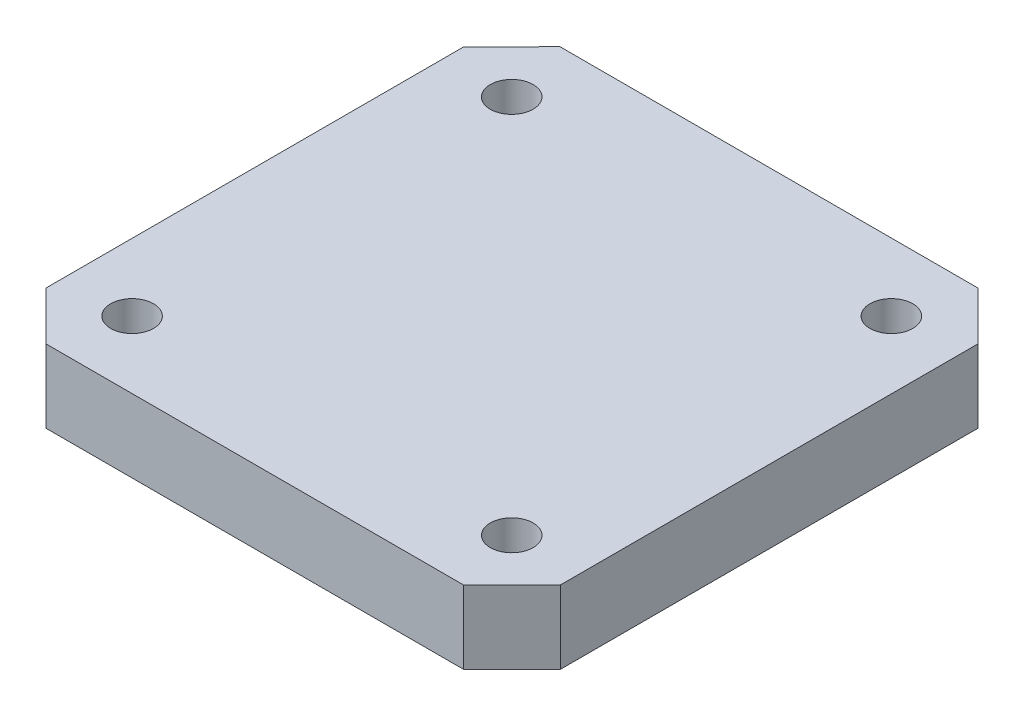
ISO-10303-21;
HEADER;
FILE_DESCRIPTION(('STEP AP214'),'2;1');
FILE_NAME('part.step','',(''),(''),'','','');
FILE_SCHEMA(('AUTOMOTIVE_DESIGN { 1 0 10303 214 1 1 1 1 }'));
ENDSEC;
DATA;
#1=APPLICATION_CONTEXT('core data for automotive mechanical design processes');
#2=APPLICATION_PROTOCOL_DEFINITION('international standard','automotive_design',2000,#1);
#3=PRODUCT_CONTEXT('',#1,'mechanical');
#4=PRODUCT('Part','Part','',(#3));
#5=PRODUCT_RELATED_PRODUCT_CATEGORY('part','',(#4));
#6=PRODUCT_DEFINITION_FORMATION('','',#4);
#7=PRODUCT_DEFINITION_CONTEXT('part definition',#1,'design');
#8=PRODUCT_DEFINITION('design','',#6,#7);
#9=PRODUCT_DEFINITION_SHAPE('','',#8);
#10=(LENGTH_UNIT() NAMED_UNIT(*) SI_UNIT(.MILLI.,.METRE.));
#11=(NAMED_UNIT(*) PLANE_ANGLE_UNIT() SI_UNIT($,.RADIAN.));
#12=(NAMED_UNIT(*) SI_UNIT($,.STERADIAN.) SOLID_ANGLE_UNIT());
#13=UNCERTAINTY_MEASURE_WITH_UNIT(LENGTH_MEASURE(1.E-05),#10,'distance_accuracy_value','');
#14=(GEOMETRIC_REPRESENTATION_CONTEXT(3) GLOBAL_UNCERTAINTY_ASSIGNED_CONTEXT((#13)) GLOBAL_UNIT_ASSIGNED_CONTEXT((#10,
#11,#12)) REPRESENTATION_CONTEXT('',''));
#15=CARTESIAN_POINT('',(0.,0.,0.));
#16=DIRECTION('',(0.,0.,1.));
#17=DIRECTION('',(1.,0.,0.));
#18=AXIS2_PLACEMENT_3D('',#15,#16,#17);
#19=CARTESIAN_POINT('',(0.,5.969,0.));
#20=DIRECTION('',(0.,0.,-1.));
#21=DIRECTION('',(-1.,0.,0.));
#22=AXIS2_PLACEMENT_3D('',#19,#20,#21);
#23=PLANE('',#22);
#24=DIRECTION('',(1.,0.,0.));
#25=VECTOR('',#24,1.);
#26=CARTESIAN_POINT('',(0.,0.,0.));
#27=LINE('',#26,#25);
#28=CARTESIAN_POINT('',(3.951224,0.,0.));
#29=VERTEX_POINT('',#28);
#30=CARTESIAN_POINT('',(38.048776,0.,0.));
#31=VERTEX_POINT('',#30);
#32=EDGE_CURVE('E134',#29,#31,#27,.T.);
#33=ORIENTED_EDGE('',*,*,#32,.T.);
#34=DIRECTION('',(0.,-1.,0.));
#35=VECTOR('',#34,1.);
#36=CARTESIAN_POINT('',(38.048776,5.969,0.));
#37=LINE('',#36,#35);
#38=CARTESIAN_POINT('',(38.048776,5.969,0.));
#39=VERTEX_POINT('',#38);
#40=EDGE_CURVE('E11',#39,#31,#37,.T.);
#41=ORIENTED_EDGE('',*,*,#40,.F.);
#42=DIRECTION('',(1.,0.,0.));
#43=VECTOR('',#42,1.);
#44=CARTESIAN_POINT('',(0.,5.969,0.));
#45=LINE('',#44,#43);
#46=CARTESIAN_POINT('',(3.951224,5.969,0.));
#47=VERTEX_POINT('',#46);
#48=EDGE_CURVE('E153',#47,#39,#45,.T.);
#49=ORIENTED_EDGE('',*,*,#48,.F.);
#50=DIRECTION('',(0.,-1.,0.));
#51=VECTOR('',#50,1.);
#52=CARTESIAN_POINT('',(3.951224,5.969,0.));
#53=LINE('',#52,#51);
#54=EDGE_CURVE('E130',#47,#29,#53,.T.);
#55=ORIENTED_EDGE('',*,*,#54,.T.);
#56=EDGE_LOOP('',(#33,#41,#49,#55));
#57=FACE_BOUND('',#56,.T.);
#58=ADVANCED_FACE('F39',(#57),#23,.F.);
#59=CARTESIAN_POINT('',(19.024388,5.969,19.024388));
#60=DIRECTION('',(-0.707106781186547,0.,-0.707106781186548));
#61=DIRECTION('',(-0.707106781186548,0.,0.707106781186547));
#62=AXIS2_PLACEMENT_3D('',#59,#60,#61);
#63=PLANE('',#62);
#64=DIRECTION('',(0.707106781186548,0.,-0.707106781186547));
#65=VECTOR('',#64,1.);
#66=CARTESIAN_POINT('',(19.024388,0.,19.024388));
#67=LINE('',#66,#65);
#68=CARTESIAN_POINT('',(42.,0.,-3.95122399999999));
#69=VERTEX_POINT('',#68);
#70=EDGE_CURVE('E137',#31,#69,#67,.T.);
#71=ORIENTED_EDGE('',*,*,#70,.T.);
#72=DIRECTION('',(0.,-1.,0.));
#73=VECTOR('',#72,1.);
#74=CARTESIAN_POINT('',(42.,5.969,-3.95122399999999));
#75=LINE('',#74,#73);
#76=CARTESIAN_POINT('',(42.,5.969,-3.95122399999999));
#77=VERTEX_POINT('',#76);
#78=EDGE_CURVE('E47',#77,#69,#75,.T.);
#79=ORIENTED_EDGE('',*,*,#78,.F.);
#80=DIRECTION('',(0.707106781186548,0.,-0.707106781186547));
#81=VECTOR('',#80,1.);
#82=CARTESIAN_POINT('',(19.024388,5.969,19.024388));
#83=LINE('',#82,#81);
#84=EDGE_CURVE('E94',#39,#77,#83,.T.);
#85=ORIENTED_EDGE('',*,*,#84,.F.);
#86=ORIENTED_EDGE('',*,*,#40,.T.);
#87=EDGE_LOOP('',(#71,#79,#85,#86));
#88=FACE_BOUND('',#87,.T.);
#89=ADVANCED_FACE('F230',(#88),#63,.F.);
#90=CARTESIAN_POINT('',(42.,5.969,0.));
#91=DIRECTION('',(-1.,0.,0.));
#92=DIRECTION('',(0.,0.,1.));
#93=AXIS2_PLACEMENT_3D('',#90,#91,#92);
#94=PLANE('',#93);
#95=DIRECTION('',(0.,0.,-1.));
#96=VECTOR('',#95,1.);
#97=CARTESIAN_POINT('',(42.,0.,0.));
#98=LINE('',#97,#96);
#99=CARTESIAN_POINT('',(42.,0.,-38.0541279210894));
#100=VERTEX_POINT('',#99);
#101=EDGE_CURVE('E140',#69,#100,#98,.T.);
#102=ORIENTED_EDGE('',*,*,#101,.T.);
#103=DIRECTION('',(0.,-1.,0.));
#104=VECTOR('',#103,1.);
#105=CARTESIAN_POINT('',(42.,5.969,-38.0541279210894));
#106=LINE('',#105,#104);
#107=CARTESIAN_POINT('',(42.,5.969,-38.0541279210894));
#108=VERTEX_POINT('',#107);
#109=EDGE_CURVE('E159',#108,#100,#106,.T.);
#110=ORIENTED_EDGE('',*,*,#109,.F.);
#111=DIRECTION('',(0.,0.,-1.));
#112=VECTOR('',#111,1.);
#113=CARTESIAN_POINT('',(42.,5.969,0.));
#114=LINE('',#113,#112);
#115=EDGE_CURVE('E166',#77,#108,#114,.T.);
#116=ORIENTED_EDGE('',*,*,#115,.F.);
#117=ORIENTED_EDGE('',*,*,#78,.T.);
#118=EDGE_LOOP('',(#102,#110,#116,#117));
#119=FACE_BOUND('',#118,.T.);
#120=ADVANCED_FACE('F164',(#119),#94,.F.);
#121=CARTESIAN_POINT('',(39.9692013751688,5.969,-40.0793455981002));
#122=DIRECTION('',(0.706133156569534,0.,-0.708079067049116));
#123=DIRECTION('',(-0.708079067049116,0.,-0.706133156569534));
#124=AXIS2_PLACEMENT_3D('',#121,#122,#123);
#125=PLANE('',#124);
#126=DIRECTION('',(0.708079067049116,0.,0.706133156569534));
#127=VECTOR('',#126,1.);
#128=CARTESIAN_POINT('',(39.9692013751688,0.,-40.0793455981002));
#129=LINE('',#128,#127);
#130=CARTESIAN_POINT('',(38.0432541733295,0.,-42.));
#131=VERTEX_POINT('',#130);
#132=EDGE_CURVE('E143',#131,#100,#129,.T.);
#133=ORIENTED_EDGE('',*,*,#132,.F.);
#134=DIRECTION('',(0.,-1.,0.));
#135=VECTOR('',#134,1.);
#136=CARTESIAN_POINT('',(38.0432541733295,5.969,-42.));
#137=LINE('',#136,#135);
#138=CARTESIAN_POINT('',(38.0432541733295,5.969,-42.));
#139=VERTEX_POINT('',#138);
#140=EDGE_CURVE('E157',#139,#131,#137,.T.);
#141=ORIENTED_EDGE('',*,*,#140,.F.);
#142=DIRECTION('',(0.708079067049116,0.,0.706133156569534));
#143=VECTOR('',#142,1.);
#144=CARTESIAN_POINT('',(39.9692013751688,5.969,-40.0793455981002));
#145=LINE('',#144,#143);
#146=EDGE_CURVE('E175',#139,#108,#145,.T.);
#147=ORIENTED_EDGE('',*,*,#146,.T.);
#148=ORIENTED_EDGE('',*,*,#109,.T.);
#149=EDGE_LOOP('',(#133,#141,#147,#148));
#150=FACE_BOUND('',#149,.T.);
#151=ADVANCED_FACE('F173',(#150),#125,.T.);
#152=CARTESIAN_POINT('',(0.,5.969,-42.));
#153=DIRECTION('',(0.,0.,-1.));
#154=DIRECTION('',(-1.,0.,0.));
#155=AXIS2_PLACEMENT_3D('',#152,#153,#154);
#156=PLANE('',#155);
#157=DIRECTION('',(1.,0.,0.));
#158=VECTOR('',#157,1.);
#159=CARTESIAN_POINT('',(0.,0.,-42.));
#160=LINE('',#159,#158);
#161=CARTESIAN_POINT('',(3.90984890363,0.,-42.));
#162=VERTEX_POINT('',#161);
#163=EDGE_CURVE('E146',#162,#131,#160,.T.);
#164=ORIENTED_EDGE('',*,*,#163,.F.);
#165=DIRECTION('',(0.,-1.,0.));
#166=VECTOR('',#165,1.);
#167=CARTESIAN_POINT('',(3.90984890363,5.969,-42.));
#168=LINE('',#167,#166);
#169=CARTESIAN_POINT('',(3.90984890363,5.969,-42.));
#170=VERTEX_POINT('',#169);
#171=EDGE_CURVE('E119',#170,#162,#168,.T.);
#172=ORIENTED_EDGE('',*,*,#171,.F.);
#173=DIRECTION('',(1.,0.,0.));
#174=VECTOR('',#173,1.);
#175=CARTESIAN_POINT('',(0.,5.969,-42.));
#176=LINE('',#175,#174);
#177=EDGE_CURVE('E126',#170,#139,#176,.T.);
#178=ORIENTED_EDGE('',*,*,#177,.T.);
#179=ORIENTED_EDGE('',*,*,#140,.T.);
#180=EDGE_LOOP('',(#164,#172,#178,#179));
#181=FACE_BOUND('',#180,.T.);
#182=ADVANCED_FACE('F246',(#181),#156,.T.);
#183=CARTESIAN_POINT('',(-18.9996851205291,5.969,-18.6070797583437));
#184=DIRECTION('',(-0.714449869476714,0.,-0.699686632718324));
#185=DIRECTION('',(-0.699686632718324,0.,0.714449869476714));
#186=AXIS2_PLACEMENT_3D('',#183,#184,#185);
#187=PLANE('',#186);
#188=DIRECTION('',(0.699686632718324,0.,-0.714449869476714));
#189=VECTOR('',#188,1.);
#190=CARTESIAN_POINT('',(-18.9996851205291,0.,-18.6070797583437));
#191=LINE('',#190,#189);
#192=CARTESIAN_POINT('',(0.,0.,-38.0076541293641));
#193=VERTEX_POINT('',#192);
#194=EDGE_CURVE('E114',#193,#162,#191,.T.);
#195=ORIENTED_EDGE('',*,*,#194,.F.);
#196=DIRECTION('',(0.,-1.,0.));
#197=VECTOR('',#196,1.);
#198=CARTESIAN_POINT('',(0.,5.969,-38.0076541293641));
#199=LINE('',#198,#197);
#200=CARTESIAN_POINT('',(0.,5.969,-38.0076541293641));
#201=VERTEX_POINT('',#200);
#202=EDGE_CURVE('E109',#201,#193,#199,.T.);
#203=ORIENTED_EDGE('',*,*,#202,.F.);
#204=DIRECTION('',(0.699686632718324,0.,-0.714449869476714));
#205=VECTOR('',#204,1.);
#206=CARTESIAN_POINT('',(-18.9996851205291,5.969,-18.6070797583437));
#207=LINE('',#206,#205);
#208=EDGE_CURVE('E112',#201,#170,#207,.T.);
#209=ORIENTED_EDGE('',*,*,#208,.T.);
#210=ORIENTED_EDGE('',*,*,#171,.T.);
#211=EDGE_LOOP('',(#195,#203,#209,#210));
#212=FACE_BOUND('',#211,.T.);
#213=ADVANCED_FACE('F111',(#212),#187,.T.);
#214=CARTESIAN_POINT('',(0.,5.969,0.));
#215=DIRECTION('',(-1.,0.,0.));
#216=DIRECTION('',(0.,0.,1.));
#217=AXIS2_PLACEMENT_3D('',#214,#215,#216);
#218=PLANE('',#217);
#219=DIRECTION('',(0.,0.,-1.));
#220=VECTOR('',#219,1.);
#221=CARTESIAN_POINT('',(0.,0.,0.));
#222=LINE('',#221,#220);
#223=CARTESIAN_POINT('',(0.,0.,-3.951224));
#224=VERTEX_POINT('',#223);
#225=EDGE_CURVE('E150',#224,#193,#222,.T.);
#226=ORIENTED_EDGE('',*,*,#225,.F.);
#227=DIRECTION('',(0.,-1.,0.));
#228=VECTOR('',#227,1.);
#229=CARTESIAN_POINT('',(0.,5.969,-3.951224));
#230=LINE('',#229,#228);
#231=CARTESIAN_POINT('',(0.,5.969,-3.951224));
#232=VERTEX_POINT('',#231);
#233=EDGE_CURVE('E83',#232,#224,#230,.T.);
#234=ORIENTED_EDGE('',*,*,#233,.F.);
#235=DIRECTION('',(0.,0.,-1.));
#236=VECTOR('',#235,1.);
#237=CARTESIAN_POINT('',(0.,5.969,0.));
#238=LINE('',#237,#236);
#239=EDGE_CURVE('E123',#232,#201,#238,.T.);
#240=ORIENTED_EDGE('',*,*,#239,.T.);
#241=ORIENTED_EDGE('',*,*,#202,.T.);
#242=EDGE_LOOP('',(#226,#234,#240,#241));
#243=FACE_BOUND('',#242,.T.);
#244=ADVANCED_FACE('F128',(#243),#218,.T.);
#245=CARTESIAN_POINT('',(1.975612,5.969,-1.975612));
#246=DIRECTION('',(0.707106781186547,0.,-0.707106781186547));
#247=DIRECTION('',(-0.707106781186548,0.,-0.707106781186548));
#248=AXIS2_PLACEMENT_3D('',#245,#246,#247);
#249=PLANE('',#248);
#250=DIRECTION('',(0.707106781186548,0.,0.707106781186548));
#251=VECTOR('',#250,1.);
#252=CARTESIAN_POINT('',(1.975612,0.,-1.975612));
#253=LINE('',#252,#251);
#254=EDGE_CURVE('E86',#224,#29,#253,.T.);
#255=ORIENTED_EDGE('',*,*,#254,.T.);
#256=ORIENTED_EDGE('',*,*,#54,.F.);
#257=DIRECTION('',(0.707106781186548,0.,0.707106781186548));
#258=VECTOR('',#257,1.);
#259=CARTESIAN_POINT('',(1.975612,5.969,-1.975612));
#260=LINE('',#259,#258);
#261=EDGE_CURVE('E55',#232,#47,#260,.T.);
#262=ORIENTED_EDGE('',*,*,#261,.F.);
#263=ORIENTED_EDGE('',*,*,#233,.T.);
#264=EDGE_LOOP('',(#255,#256,#262,#263));
#265=FACE_BOUND('',#264,.T.);
#266=ADVANCED_FACE('F209',(#265),#249,.F.);
#267=CARTESIAN_POINT('',(0.,5.969,0.));
#268=DIRECTION('',(0.,1.,0.));
#269=DIRECTION('',(0.,0.,1.));
#270=AXIS2_PLACEMENT_3D('',#267,#268,#269);
#271=PLANE('',#270);
#272=CARTESIAN_POINT('',(5.5,5.969,-5.47943906468206));
#273=DIRECTION('',(0.,1.,0.));
#274=DIRECTION('',(0.,0.,1.));
#275=AXIS2_PLACEMENT_3D('',#272,#273,#274);
#276=CIRCLE('',#275,1.750000056);
#277=CARTESIAN_POINT('',(5.5,5.969,-3.72943900868206));
#278=VERTEX_POINT('',#277);
#279=EDGE_CURVE('E190',#278,#278,#276,.T.);
#280=ORIENTED_EDGE('',*,*,#279,.F.);
#281=EDGE_LOOP('',(#280));
#282=FACE_BOUND('',#281,.T.);
#283=CARTESIAN_POINT('',(36.5,5.969,-5.47943906468206));
#284=DIRECTION('',(0.,1.,0.));
#285=DIRECTION('',(0.,0.,1.));
#286=AXIS2_PLACEMENT_3D('',#283,#284,#285);
#287=CIRCLE('',#286,1.750000056);
#288=CARTESIAN_POINT('',(36.5,5.969,-3.72943900868207));
#289=VERTEX_POINT('',#288);
#290=EDGE_CURVE('E196',#289,#289,#287,.T.);
#291=ORIENTED_EDGE('',*,*,#290,.F.);
#292=EDGE_LOOP('',(#291));
#293=FACE_BOUND('',#292,.T.);
#294=CARTESIAN_POINT('',(36.5,5.969,-36.4794390646821));
#295=DIRECTION('',(0.,1.,0.));
#296=DIRECTION('',(0.,0.,1.));
#297=AXIS2_PLACEMENT_3D('',#294,#295,#296);
#298=CIRCLE('',#297,1.75000005599999);
#299=CARTESIAN_POINT('',(36.5,5.969,-34.7294390086821));
#300=VERTEX_POINT('',#299);
#301=EDGE_CURVE('E184',#300,#300,#298,.T.);
#302=ORIENTED_EDGE('',*,*,#301,.F.);
#303=EDGE_LOOP('',(#302));
#304=FACE_BOUND('',#303,.T.);
#305=CARTESIAN_POINT('',(5.49999999999999,5.969,-36.4794390646821));
#306=DIRECTION('',(0.,1.,0.));
#307=DIRECTION('',(0.,0.,1.));
#308=AXIS2_PLACEMENT_3D('',#305,#306,#307);
#309=CIRCLE('',#308,1.75);
#310=CARTESIAN_POINT('',(5.49999999999999,5.969,-34.7294390646821));
#311=VERTEX_POINT('',#310);
#312=EDGE_CURVE('E181',#311,#311,#309,.T.);
#313=ORIENTED_EDGE('',*,*,#312,.F.);
#314=EDGE_LOOP('',(#313));
#315=FACE_BOUND('',#314,.T.);
#316=ORIENTED_EDGE('',*,*,#48,.T.);
#317=ORIENTED_EDGE('',*,*,#84,.T.);
#318=ORIENTED_EDGE('',*,*,#115,.T.);
#319=ORIENTED_EDGE('',*,*,#146,.F.);
#320=ORIENTED_EDGE('',*,*,#177,.F.);
#321=ORIENTED_EDGE('',*,*,#208,.F.);
#322=ORIENTED_EDGE('',*,*,#239,.F.);
#323=ORIENTED_EDGE('',*,*,#261,.T.);
#324=EDGE_LOOP('',(#316,#317,#318,#319,#320,#321,#322,#323));
#325=FACE_BOUND('',#324,.T.);
#326=ADVANCED_FACE('F122',(#282,#293,#304,#315,#325),#271,.T.);
#327=CARTESIAN_POINT('',(0.,0.,0.));
#328=DIRECTION('',(0.,1.,0.));
#329=DIRECTION('',(0.,0.,1.));
#330=AXIS2_PLACEMENT_3D('',#327,#328,#329);
#331=PLANE('',#330);
#332=CARTESIAN_POINT('',(5.5,0.,-5.47943906468206));
#333=DIRECTION('',(0.,1.,0.));
#334=DIRECTION('',(0.,0.,1.));
#335=AXIS2_PLACEMENT_3D('',#332,#333,#334);
#336=CIRCLE('',#335,1.750000056);
#337=CARTESIAN_POINT('',(5.5,0.,-3.72943900868206));
#338=VERTEX_POINT('',#337);
#339=EDGE_CURVE('E187',#338,#338,#336,.T.);
#340=ORIENTED_EDGE('',*,*,#339,.T.);
#341=EDGE_LOOP('',(#340));
#342=FACE_BOUND('',#341,.T.);
#343=CARTESIAN_POINT('',(36.5,0.,-5.47943906468206));
#344=DIRECTION('',(0.,1.,0.));
#345=DIRECTION('',(0.,0.,1.));
#346=AXIS2_PLACEMENT_3D('',#343,#344,#345);
#347=CIRCLE('',#346,1.750000056);
#348=CARTESIAN_POINT('',(36.5,0.,-3.72943900868207));
#349=VERTEX_POINT('',#348);
#350=EDGE_CURVE('E193',#349,#349,#347,.T.);
#351=ORIENTED_EDGE('',*,*,#350,.T.);
#352=EDGE_LOOP('',(#351));
#353=FACE_BOUND('',#352,.T.);
#354=CARTESIAN_POINT('',(36.5,0.,-36.4794390646821));
#355=DIRECTION('',(0.,1.,0.));
#356=DIRECTION('',(0.,0.,1.));
#357=AXIS2_PLACEMENT_3D('',#354,#355,#356);
#358=CIRCLE('',#357,1.75000005599999);
#359=CARTESIAN_POINT('',(36.5,0.,-34.7294390086821));
#360=VERTEX_POINT('',#359);
#361=EDGE_CURVE('E199',#360,#360,#358,.T.);
#362=ORIENTED_EDGE('',*,*,#361,.T.);
#363=EDGE_LOOP('',(#362));
#364=FACE_BOUND('',#363,.T.);
#365=CARTESIAN_POINT('',(5.49999999999999,0.,-36.4794390646821));
#366=DIRECTION('',(0.,1.,0.));
#367=DIRECTION('',(0.,0.,1.));
#368=AXIS2_PLACEMENT_3D('',#365,#366,#367);
#369=CIRCLE('',#368,1.75);
#370=CARTESIAN_POINT('',(5.49999999999999,0.,-34.7294390646821));
#371=VERTEX_POINT('',#370);
#372=EDGE_CURVE('E138',#371,#371,#369,.T.);
#373=ORIENTED_EDGE('',*,*,#372,.T.);
#374=EDGE_LOOP('',(#373));
#375=FACE_BOUND('',#374,.T.);
#376=ORIENTED_EDGE('',*,*,#32,.F.);
#377=ORIENTED_EDGE('',*,*,#254,.F.);
#378=ORIENTED_EDGE('',*,*,#225,.T.);
#379=ORIENTED_EDGE('',*,*,#194,.T.);
#380=ORIENTED_EDGE('',*,*,#163,.T.);
#381=ORIENTED_EDGE('',*,*,#132,.T.);
#382=ORIENTED_EDGE('',*,*,#101,.F.);
#383=ORIENTED_EDGE('',*,*,#70,.F.);
#384=EDGE_LOOP('',(#376,#377,#378,#379,#380,#381,#382,#383));
#385=FACE_BOUND('',#384,.T.);
#386=ADVANCED_FACE('F169',(#342,#353,#364,#375,#385),#331,.F.);
#387=CARTESIAN_POINT('',(5.49999999999999,0.,-36.4794390646821));
#388=DIRECTION('',(0.,1.,0.));
#389=DIRECTION('',(0.,0.,1.));
#390=AXIS2_PLACEMENT_3D('',#387,#388,#389);
#391=CYLINDRICAL_SURFACE('',#390,1.75);
#392=ORIENTED_EDGE('',*,*,#372,.F.);
#393=EDGE_LOOP('',(#392));
#394=FACE_BOUND('',#393,.T.);
#395=ORIENTED_EDGE('',*,*,#312,.T.);
#396=EDGE_LOOP('',(#395));
#397=FACE_BOUND('',#396,.T.);
#398=ADVANCED_FACE('F214',(#394,#397),#391,.F.);
#399=CARTESIAN_POINT('',(36.5,0.,-36.4794390646821));
#400=DIRECTION('',(0.,1.,0.));
#401=DIRECTION('',(0.,0.,1.));
#402=AXIS2_PLACEMENT_3D('',#399,#400,#401);
#403=CYLINDRICAL_SURFACE('',#402,1.75000005599999);
#404=ORIENTED_EDGE('',*,*,#361,.F.);
#405=EDGE_LOOP('',(#404));
#406=FACE_BOUND('',#405,.T.);
#407=ORIENTED_EDGE('',*,*,#301,.T.);
#408=EDGE_LOOP('',(#407));
#409=FACE_BOUND('',#408,.T.);
#410=ADVANCED_FACE('F205',(#406,#409),#403,.F.);
#411=CARTESIAN_POINT('',(36.5,0.,-5.47943906468206));
#412=DIRECTION('',(0.,1.,0.));
#413=DIRECTION('',(0.,0.,1.));
#414=AXIS2_PLACEMENT_3D('',#411,#412,#413);
#415=CYLINDRICAL_SURFACE('',#414,1.750000056);
#416=ORIENTED_EDGE('',*,*,#350,.F.);
#417=EDGE_LOOP('',(#416));
#418=FACE_BOUND('',#417,.T.);
#419=ORIENTED_EDGE('',*,*,#290,.T.);
#420=EDGE_LOOP('',(#419));
#421=FACE_BOUND('',#420,.T.);
#422=ADVANCED_FACE('F222',(#418,#421),#415,.F.);
#423=CARTESIAN_POINT('',(5.5,0.,-5.47943906468206));
#424=DIRECTION('',(0.,1.,0.));
#425=DIRECTION('',(0.,0.,1.));
#426=AXIS2_PLACEMENT_3D('',#423,#424,#425);
#427=CYLINDRICAL_SURFACE('',#426,1.750000056);
#428=ORIENTED_EDGE('',*,*,#339,.F.);
#429=EDGE_LOOP('',(#428));
#430=FACE_BOUND('',#429,.T.);
#431=ORIENTED_EDGE('',*,*,#279,.T.);
#432=EDGE_LOOP('',(#431));
#433=FACE_BOUND('',#432,.T.);
#434=ADVANCED_FACE('F313',(#430,#433),#427,.F.);
#435=CLOSED_SHELL('',(#58,#89,#120,#151,#182,#213,#244,#266,#326,#386,#398,#410,#422,#434));
#436=MANIFOLD_SOLID_BREP('B2',#435);
#437=ADVANCED_BREP_SHAPE_REPRESENTATION('',(#18,#436),#14);
#438=SHAPE_DEFINITION_REPRESENTATION(#9,#437);
ENDSEC;
END-ISO-10303-21;
